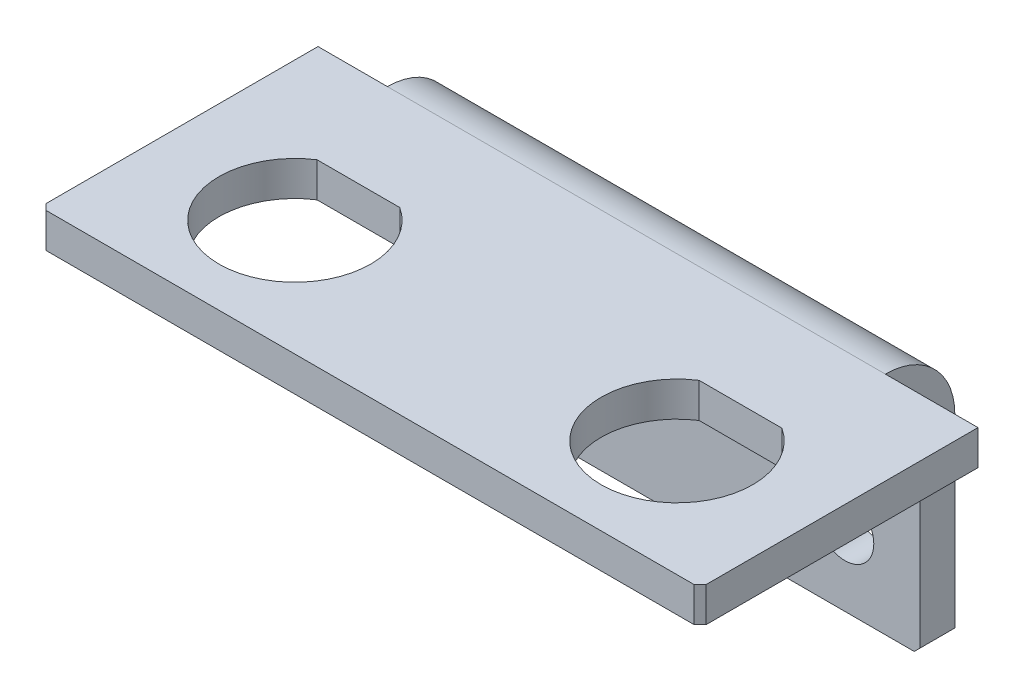
ISO-10303-21;
HEADER;
FILE_DESCRIPTION(('STEP AP214'),'2;1');
FILE_NAME('part.step','',(''),(''),'','','');
FILE_SCHEMA(('AUTOMOTIVE_DESIGN { 1 0 10303 214 1 1 1 1 }'));
ENDSEC;
DATA;
#1=APPLICATION_CONTEXT('core data for automotive mechanical design processes');
#2=APPLICATION_PROTOCOL_DEFINITION('international standard','automotive_design',2000,#1);
#3=PRODUCT_CONTEXT('',#1,'mechanical');
#4=PRODUCT('Part','Part','',(#3));
#5=PRODUCT_RELATED_PRODUCT_CATEGORY('part','',(#4));
#6=PRODUCT_DEFINITION_FORMATION('','',#4);
#7=PRODUCT_DEFINITION_CONTEXT('part definition',#1,'design');
#8=PRODUCT_DEFINITION('design','',#6,#7);
#9=PRODUCT_DEFINITION_SHAPE('','',#8);
#10=(LENGTH_UNIT() NAMED_UNIT(*) SI_UNIT(.MILLI.,.METRE.));
#11=(NAMED_UNIT(*) PLANE_ANGLE_UNIT() SI_UNIT($,.RADIAN.));
#12=(NAMED_UNIT(*) SI_UNIT($,.STERADIAN.) SOLID_ANGLE_UNIT());
#13=UNCERTAINTY_MEASURE_WITH_UNIT(LENGTH_MEASURE(1.E-05),#10,'distance_accuracy_value','');
#14=(GEOMETRIC_REPRESENTATION_CONTEXT(3) GLOBAL_UNCERTAINTY_ASSIGNED_CONTEXT((#13)) GLOBAL_UNIT_ASSIGNED_CONTEXT((#10,
#11,#12)) REPRESENTATION_CONTEXT('',''));
#15=CARTESIAN_POINT('',(0.,0.,0.));
#16=DIRECTION('',(0.,0.,1.));
#17=DIRECTION('',(1.,0.,0.));
#18=AXIS2_PLACEMENT_3D('',#15,#16,#17);
#19=CARTESIAN_POINT('',(0.,0.,-1.5));
#20=DIRECTION('',(0.,0.,1.));
#21=DIRECTION('',(1.,0.,0.));
#22=AXIS2_PLACEMENT_3D('',#19,#20,#21);
#23=PLANE('',#22);
#24=CARTESIAN_POINT('',(3.25,3.15,-1.5));
#25=DIRECTION('',(0.,0.,1.));
#26=DIRECTION('',(1.,0.,0.));
#27=AXIS2_PLACEMENT_3D('',#24,#25,#26);
#28=CIRCLE('',#27,1.25);
#29=CARTESIAN_POINT('',(4.5,3.15,-1.5));
#30=VERTEX_POINT('',#29);
#31=EDGE_CURVE('E204',#30,#30,#28,.T.);
#32=ORIENTED_EDGE('',*,*,#31,.T.);
#33=EDGE_LOOP('',(#32));
#34=FACE_BOUND('',#33,.T.);
#35=CARTESIAN_POINT('',(18.25,3.15,-1.5));
#36=DIRECTION('',(0.,0.,1.));
#37=DIRECTION('',(1.,0.,0.));
#38=AXIS2_PLACEMENT_3D('',#35,#36,#37);
#39=CIRCLE('',#38,1.25);
#40=CARTESIAN_POINT('',(19.5,3.15,-1.5));
#41=VERTEX_POINT('',#40);
#42=EDGE_CURVE('E20',#41,#41,#39,.T.);
#43=ORIENTED_EDGE('',*,*,#42,.T.);
#44=EDGE_LOOP('',(#43));
#45=FACE_BOUND('',#44,.T.);
#46=DIRECTION('',(0.,1.,0.));
#47=VECTOR('',#46,1.);
#48=CARTESIAN_POINT('',(0.,5.625,-1.5));
#49=LINE('',#48,#47);
#50=CARTESIAN_POINT('',(0.,8.25,-1.5));
#51=VERTEX_POINT('',#50);
#52=CARTESIAN_POINT('',(0.,0.254,-1.5));
#53=VERTEX_POINT('',#52);
#54=EDGE_CURVE('E228',#51,#53,#49,.F.);
#55=ORIENTED_EDGE('',*,*,#54,.F.);
#56=DIRECTION('',(-1.,0.,0.));
#57=VECTOR('',#56,1.);
#58=CARTESIAN_POINT('',(21.5,8.25,-1.5));
#59=LINE('',#58,#57);
#60=CARTESIAN_POINT('',(21.5,8.25,-1.5));
#61=VERTEX_POINT('',#60);
#62=EDGE_CURVE('E203',#61,#51,#59,.T.);
#63=ORIENTED_EDGE('',*,*,#62,.F.);
#64=DIRECTION('',(0.,1.,0.));
#65=VECTOR('',#64,1.);
#66=CARTESIAN_POINT('',(21.5,7.803097245096,-1.5));
#67=LINE('',#66,#65);
#68=CARTESIAN_POINT('',(21.5,0.254000000000003,-1.5));
#69=VERTEX_POINT('',#68);
#70=EDGE_CURVE('E160',#61,#69,#67,.F.);
#71=ORIENTED_EDGE('',*,*,#70,.T.);
#72=DIRECTION('',(0.707106781186498,0.707106781186598,0.));
#73=VECTOR('',#72,1.);
#74=CARTESIAN_POINT('',(21.373,0.127,-1.5));
#75=LINE('',#74,#73);
#76=CARTESIAN_POINT('',(21.246,0.,-1.5));
#77=VERTEX_POINT('',#76);
#78=EDGE_CURVE('E153',#77,#69,#75,.T.);
#79=ORIENTED_EDGE('',*,*,#78,.F.);
#80=DIRECTION('',(1.,0.,0.));
#81=VECTOR('',#80,1.);
#82=CARTESIAN_POINT('',(10.75,0.,-1.5));
#83=LINE('',#82,#81);
#84=CARTESIAN_POINT('',(0.254,0.,-1.5));
#85=VERTEX_POINT('',#84);
#86=EDGE_CURVE('E138',#85,#77,#83,.T.);
#87=ORIENTED_EDGE('',*,*,#86,.F.);
#88=DIRECTION('',(0.707106781186548,-0.707106781186548,0.));
#89=VECTOR('',#88,1.);
#90=CARTESIAN_POINT('',(0.127,0.127,-1.5));
#91=LINE('',#90,#89);
#92=EDGE_CURVE('E213',#53,#85,#91,.T.);
#93=ORIENTED_EDGE('',*,*,#92,.F.);
#94=EDGE_LOOP('',(#55,#63,#71,#79,#87,#93));
#95=FACE_BOUND('',#94,.T.);
#96=ADVANCED_FACE('F17',(#34,#45,#95),#23,.F.);
#97=CARTESIAN_POINT('',(10.75,0.,-0.75));
#98=DIRECTION('',(0.,-1.,0.));
#99=DIRECTION('',(0.,0.,-1.));
#100=AXIS2_PLACEMENT_3D('',#97,#98,#99);
#101=PLANE('',#100);
#102=DIRECTION('',(1.,0.,0.));
#103=VECTOR('',#102,1.);
#104=CARTESIAN_POINT('',(0.,0.,0.));
#105=LINE('',#104,#103);
#106=CARTESIAN_POINT('',(0.254,0.,0.));
#107=VERTEX_POINT('',#106);
#108=CARTESIAN_POINT('',(21.246,0.,0.));
#109=VERTEX_POINT('',#108);
#110=EDGE_CURVE('E202',#107,#109,#105,.T.);
#111=ORIENTED_EDGE('',*,*,#110,.F.);
#112=DIRECTION('',(0.,0.,1.));
#113=VECTOR('',#112,1.);
#114=CARTESIAN_POINT('',(0.254,0.,-0.75));
#115=LINE('',#114,#113);
#116=EDGE_CURVE('E144',#85,#107,#115,.T.);
#117=ORIENTED_EDGE('',*,*,#116,.F.);
#118=ORIENTED_EDGE('',*,*,#86,.T.);
#119=DIRECTION('',(0.,0.,1.));
#120=VECTOR('',#119,1.);
#121=CARTESIAN_POINT('',(21.246,0.,-0.75));
#122=LINE('',#121,#120);
#123=EDGE_CURVE('E142',#109,#77,#122,.F.);
#124=ORIENTED_EDGE('',*,*,#123,.F.);
#125=EDGE_LOOP('',(#111,#117,#118,#124));
#126=FACE_BOUND('',#125,.T.);
#127=ADVANCED_FACE('F141',(#126),#101,.T.);
#128=CARTESIAN_POINT('',(21.373,0.127,-0.75));
#129=DIRECTION('',(0.707106781186598,-0.707106781186498,0.));
#130=DIRECTION('',(0.707106781186498,0.707106781186598,0.));
#131=AXIS2_PLACEMENT_3D('',#128,#129,#130);
#132=PLANE('',#131);
#133=DIRECTION('',(0.,0.,-1.));
#134=VECTOR('',#133,1.);
#135=CARTESIAN_POINT('',(21.5,0.254,-0.75));
#136=LINE('',#135,#134);
#137=CARTESIAN_POINT('',(21.5,0.254,0.));
#138=VERTEX_POINT('',#137);
#139=EDGE_CURVE('E161',#138,#69,#136,.T.);
#140=ORIENTED_EDGE('',*,*,#139,.F.);
#141=DIRECTION('',(0.707106781186553,0.707106781186542,0.));
#142=VECTOR('',#141,1.);
#143=CARTESIAN_POINT('',(21.246,0.,0.));
#144=LINE('',#143,#142);
#145=EDGE_CURVE('E156',#109,#138,#144,.T.);
#146=ORIENTED_EDGE('',*,*,#145,.F.);
#147=ORIENTED_EDGE('',*,*,#123,.T.);
#148=ORIENTED_EDGE('',*,*,#78,.T.);
#149=EDGE_LOOP('',(#140,#146,#147,#148));
#150=FACE_BOUND('',#149,.T.);
#151=ADVANCED_FACE('F152',(#150),#132,.T.);
#152=CARTESIAN_POINT('',(0.127,0.127,-0.75));
#153=DIRECTION('',(-0.707106781186548,-0.707106781186548,0.));
#154=DIRECTION('',(0.707106781186548,-0.707106781186548,0.));
#155=AXIS2_PLACEMENT_3D('',#152,#153,#154);
#156=PLANE('',#155);
#157=ORIENTED_EDGE('',*,*,#116,.T.);
#158=DIRECTION('',(0.707106781186548,-0.707106781186548,0.));
#159=VECTOR('',#158,1.);
#160=CARTESIAN_POINT('',(0.,0.254,0.));
#161=LINE('',#160,#159);
#162=CARTESIAN_POINT('',(0.,0.254,0.));
#163=VERTEX_POINT('',#162);
#164=EDGE_CURVE('E201',#163,#107,#161,.T.);
#165=ORIENTED_EDGE('',*,*,#164,.F.);
#166=DIRECTION('',(0.,0.,1.));
#167=VECTOR('',#166,1.);
#168=CARTESIAN_POINT('',(0.,0.254,-0.75));
#169=LINE('',#168,#167);
#170=EDGE_CURVE('E219',#163,#53,#169,.F.);
#171=ORIENTED_EDGE('',*,*,#170,.T.);
#172=ORIENTED_EDGE('',*,*,#92,.T.);
#173=EDGE_LOOP('',(#157,#165,#171,#172));
#174=FACE_BOUND('',#173,.T.);
#175=ADVANCED_FACE('F243',(#174),#156,.T.);
#176=CARTESIAN_POINT('',(18.25,3.15,-3.15));
#177=DIRECTION('',(0.,0.,1.));
#178=DIRECTION('',(1.,0.,0.));
#179=AXIS2_PLACEMENT_3D('',#176,#177,#178);
#180=CYLINDRICAL_SURFACE('',#179,1.25);
#181=ORIENTED_EDGE('',*,*,#42,.F.);
#182=EDGE_LOOP('',(#181));
#183=FACE_BOUND('',#182,.T.);
#184=CARTESIAN_POINT('',(18.25,3.15,0.));
#185=DIRECTION('',(0.,0.,1.));
#186=DIRECTION('',(1.,0.,0.));
#187=AXIS2_PLACEMENT_3D('',#184,#185,#186);
#188=CIRCLE('',#187,1.25);
#189=CARTESIAN_POINT('',(19.5,3.15,0.));
#190=VERTEX_POINT('',#189);
#191=EDGE_CURVE('E198',#190,#190,#188,.F.);
#192=ORIENTED_EDGE('',*,*,#191,.F.);
#193=EDGE_LOOP('',(#192));
#194=FACE_BOUND('',#193,.T.);
#195=ADVANCED_FACE('F486',(#183,#194),#180,.F.);
#196=CARTESIAN_POINT('',(3.25,3.15,-3.154987396586));
#197=DIRECTION('',(0.,0.,1.));
#198=DIRECTION('',(1.,0.,0.));
#199=AXIS2_PLACEMENT_3D('',#196,#197,#198);
#200=CYLINDRICAL_SURFACE('',#199,1.25);
#201=ORIENTED_EDGE('',*,*,#31,.F.);
#202=EDGE_LOOP('',(#201));
#203=FACE_BOUND('',#202,.T.);
#204=CARTESIAN_POINT('',(3.25,3.15,0.));
#205=DIRECTION('',(0.,0.,1.));
#206=DIRECTION('',(1.,0.,0.));
#207=AXIS2_PLACEMENT_3D('',#204,#205,#206);
#208=CIRCLE('',#207,1.25);
#209=CARTESIAN_POINT('',(4.5,3.15,0.));
#210=VERTEX_POINT('',#209);
#211=EDGE_CURVE('E195',#210,#210,#208,.F.);
#212=ORIENTED_EDGE('',*,*,#211,.F.);
#213=EDGE_LOOP('',(#212));
#214=FACE_BOUND('',#213,.T.);
#215=ADVANCED_FACE('F483',(#203,#214),#200,.F.);
#216=CARTESIAN_POINT('',(21.5,8.25,1.5));
#217=DIRECTION('',(-1.,0.,0.));
#218=DIRECTION('',(0.,0.,1.));
#219=AXIS2_PLACEMENT_3D('',#216,#217,#218);
#220=CYLINDRICAL_SURFACE('',#219,3.);
#221=ORIENTED_EDGE('',*,*,#62,.T.);
#222=CARTESIAN_POINT('',(0.,8.25,1.5));
#223=DIRECTION('',(-1.,0.,0.));
#224=DIRECTION('',(0.,0.,1.));
#225=AXIS2_PLACEMENT_3D('',#222,#223,#224);
#226=CIRCLE('',#225,3.);
#227=CARTESIAN_POINT('',(0.,11.25,1.5));
#228=VERTEX_POINT('',#227);
#229=EDGE_CURVE('E191',#51,#228,#226,.F.);
#230=ORIENTED_EDGE('',*,*,#229,.T.);
#231=DIRECTION('',(1.,0.,0.));
#232=VECTOR('',#231,1.);
#233=CARTESIAN_POINT('',(0.,11.25,1.5));
#234=LINE('',#233,#232);
#235=CARTESIAN_POINT('',(21.5,11.25,1.5));
#236=VERTEX_POINT('',#235);
#237=EDGE_CURVE('E194',#236,#228,#234,.F.);
#238=ORIENTED_EDGE('',*,*,#237,.F.);
#239=CARTESIAN_POINT('',(21.5,8.25,1.5));
#240=DIRECTION('',(-1.,0.,0.));
#241=DIRECTION('',(0.,0.,1.));
#242=AXIS2_PLACEMENT_3D('',#239,#240,#241);
#243=CIRCLE('',#242,3.);
#244=EDGE_CURVE('E88',#236,#61,#243,.T.);
#245=ORIENTED_EDGE('',*,*,#244,.T.);
#246=EDGE_LOOP('',(#221,#230,#238,#245));
#247=FACE_BOUND('',#246,.T.);
#248=ADVANCED_FACE('F461',(#247),#220,.T.);
#249=CARTESIAN_POINT('',(21.5,8.303093886215,-0.75));
#250=DIRECTION('',(-1.,0.,0.));
#251=DIRECTION('',(0.,0.,1.));
#252=AXIS2_PLACEMENT_3D('',#249,#250,#251);
#253=PLANE('',#252);
#254=ORIENTED_EDGE('',*,*,#244,.F.);
#255=DIRECTION('',(0.,1.,0.));
#256=VECTOR('',#255,1.);
#257=CARTESIAN_POINT('',(21.5,10.5,1.5));
#258=LINE('',#257,#256);
#259=CARTESIAN_POINT('',(21.5,9.75,1.5));
#260=VERTEX_POINT('',#259);
#261=EDGE_CURVE('E190',#236,#260,#258,.F.);
#262=ORIENTED_EDGE('',*,*,#261,.T.);
#263=CARTESIAN_POINT('',(21.5,8.25,1.5));
#264=DIRECTION('',(-1.,0.,0.));
#265=DIRECTION('',(0.,0.,1.));
#266=AXIS2_PLACEMENT_3D('',#263,#264,#265);
#267=CIRCLE('',#266,1.5);
#268=CARTESIAN_POINT('',(21.5,8.25,0.));
#269=VERTEX_POINT('',#268);
#270=EDGE_CURVE('E183',#260,#269,#267,.T.);
#271=ORIENTED_EDGE('',*,*,#270,.T.);
#272=DIRECTION('',(0.,1.,0.));
#273=VECTOR('',#272,1.);
#274=CARTESIAN_POINT('',(21.5,0.,0.));
#275=LINE('',#274,#273);
#276=EDGE_CURVE('E246',#138,#269,#275,.T.);
#277=ORIENTED_EDGE('',*,*,#276,.F.);
#278=ORIENTED_EDGE('',*,*,#139,.T.);
#279=ORIENTED_EDGE('',*,*,#70,.F.);
#280=EDGE_LOOP('',(#254,#262,#271,#277,#278,#279));
#281=FACE_BOUND('',#280,.T.);
#282=ADVANCED_FACE('F459',(#281),#253,.F.);
#283=CARTESIAN_POINT('',(0.,0.,0.));
#284=DIRECTION('',(0.,0.,1.));
#285=DIRECTION('',(1.,0.,0.));
#286=AXIS2_PLACEMENT_3D('',#283,#284,#285);
#287=PLANE('',#286);
#288=ORIENTED_EDGE('',*,*,#211,.T.);
#289=EDGE_LOOP('',(#288));
#290=FACE_BOUND('',#289,.T.);
#291=ORIENTED_EDGE('',*,*,#191,.T.);
#292=EDGE_LOOP('',(#291));
#293=FACE_BOUND('',#292,.T.);
#294=DIRECTION('',(0.,1.,0.));
#295=VECTOR('',#294,1.);
#296=CARTESIAN_POINT('',(0.,0.,0.));
#297=LINE('',#296,#295);
#298=CARTESIAN_POINT('',(0.,8.25,0.));
#299=VERTEX_POINT('',#298);
#300=EDGE_CURVE('E245',#299,#163,#297,.F.);
#301=ORIENTED_EDGE('',*,*,#300,.T.);
#302=ORIENTED_EDGE('',*,*,#164,.T.);
#303=ORIENTED_EDGE('',*,*,#110,.T.);
#304=ORIENTED_EDGE('',*,*,#145,.T.);
#305=ORIENTED_EDGE('',*,*,#276,.T.);
#306=DIRECTION('',(-1.,0.,0.));
#307=VECTOR('',#306,1.);
#308=CARTESIAN_POINT('',(21.5,8.25,0.));
#309=LINE('',#308,#307);
#310=EDGE_CURVE('E186',#269,#299,#309,.T.);
#311=ORIENTED_EDGE('',*,*,#310,.T.);
#312=EDGE_LOOP('',(#301,#302,#303,#304,#305,#311));
#313=FACE_BOUND('',#312,.T.);
#314=ADVANCED_FACE('F475',(#290,#293,#313),#287,.T.);
#315=CARTESIAN_POINT('',(0.,9.856191131311,-0.75));
#316=DIRECTION('',(1.,0.,0.));
#317=DIRECTION('',(0.,0.,-1.));
#318=AXIS2_PLACEMENT_3D('',#315,#316,#317);
#319=PLANE('',#318);
#320=ORIENTED_EDGE('',*,*,#229,.F.);
#321=ORIENTED_EDGE('',*,*,#54,.T.);
#322=ORIENTED_EDGE('',*,*,#170,.F.);
#323=ORIENTED_EDGE('',*,*,#300,.F.);
#324=CARTESIAN_POINT('',(0.,8.25,1.5));
#325=DIRECTION('',(-1.,0.,0.));
#326=DIRECTION('',(0.,0.,1.));
#327=AXIS2_PLACEMENT_3D('',#324,#325,#326);
#328=CIRCLE('',#327,1.5);
#329=CARTESIAN_POINT('',(0.,9.75,1.5));
#330=VERTEX_POINT('',#329);
#331=EDGE_CURVE('E187',#299,#330,#328,.F.);
#332=ORIENTED_EDGE('',*,*,#331,.T.);
#333=DIRECTION('',(0.,1.,0.));
#334=VECTOR('',#333,1.);
#335=CARTESIAN_POINT('',(0.,10.5,1.5));
#336=LINE('',#335,#334);
#337=EDGE_CURVE('E343',#228,#330,#336,.F.);
#338=ORIENTED_EDGE('',*,*,#337,.F.);
#339=EDGE_LOOP('',(#320,#321,#322,#323,#332,#338));
#340=FACE_BOUND('',#339,.T.);
#341=ADVANCED_FACE('F241',(#340),#319,.F.);
#342=CARTESIAN_POINT('',(0.,11.25,-1.5));
#343=DIRECTION('',(0.,1.,0.));
#344=DIRECTION('',(0.,0.,1.));
#345=AXIS2_PLACEMENT_3D('',#342,#343,#344);
#346=PLANE('',#345);
#347=DIRECTION('',(-1.,0.,0.));
#348=VECTOR('',#347,1.);
#349=CARTESIAN_POINT('',(3.,11.25,5.755));
#350=LINE('',#349,#348);
#351=CARTESIAN_POINT('',(1.21377493019498,11.25,5.755));
#352=VERTEX_POINT('',#351);
#353=CARTESIAN_POINT('',(4.78622506980502,11.25,5.755));
#354=VERTEX_POINT('',#353);
#355=EDGE_CURVE('E358',#352,#354,#350,.F.);
#356=ORIENTED_EDGE('',*,*,#355,.T.);
#357=CARTESIAN_POINT('',(3.,11.25,8.5));
#358=DIRECTION('',(0.,1.,0.));
#359=DIRECTION('',(0.,0.,1.));
#360=AXIS2_PLACEMENT_3D('',#357,#358,#359);
#361=CIRCLE('',#360,3.275);
#362=EDGE_CURVE('E175',#354,#352,#361,.F.);
#363=ORIENTED_EDGE('',*,*,#362,.T.);
#364=EDGE_LOOP('',(#356,#363));
#365=FACE_BOUND('',#364,.T.);
#366=DIRECTION('',(-1.,0.,0.));
#367=VECTOR('',#366,1.);
#368=CARTESIAN_POINT('',(19.5,11.25,5.755));
#369=LINE('',#368,#367);
#370=CARTESIAN_POINT('',(17.7137749301925,11.25,5.755));
#371=VERTEX_POINT('',#370);
#372=CARTESIAN_POINT('',(21.2862250698075,11.25,5.755));
#373=VERTEX_POINT('',#372);
#374=EDGE_CURVE('E355',#371,#373,#369,.F.);
#375=ORIENTED_EDGE('',*,*,#374,.T.);
#376=CARTESIAN_POINT('',(19.5,11.25,8.5));
#377=DIRECTION('',(0.,1.,0.));
#378=DIRECTION('',(0.,0.,1.));
#379=AXIS2_PLACEMENT_3D('',#376,#377,#378);
#380=CIRCLE('',#379,3.275);
#381=EDGE_CURVE('E179',#373,#371,#380,.F.);
#382=ORIENTED_EDGE('',*,*,#381,.T.);
#383=EDGE_LOOP('',(#375,#382));
#384=FACE_BOUND('',#383,.T.);
#385=DIRECTION('',(0.,0.,1.));
#386=VECTOR('',#385,1.);
#387=CARTESIAN_POINT('',(-3.,11.25,6.));
#388=LINE('',#387,#386);
#389=CARTESIAN_POINT('',(-3.,11.25,13.246));
#390=VERTEX_POINT('',#389);
#391=CARTESIAN_POINT('',(-3.,11.25,1.5));
#392=VERTEX_POINT('',#391);
#393=EDGE_CURVE('E338',#390,#392,#388,.F.);
#394=ORIENTED_EDGE('',*,*,#393,.F.);
#395=DIRECTION('',(0.707106781186598,0.,0.707106781186498));
#396=VECTOR('',#395,1.);
#397=CARTESIAN_POINT('',(-2.873,11.25,13.373));
#398=LINE('',#397,#396);
#399=CARTESIAN_POINT('',(-2.746,11.25,13.5));
#400=VERTEX_POINT('',#399);
#401=EDGE_CURVE('E275',#400,#390,#398,.F.);
#402=ORIENTED_EDGE('',*,*,#401,.F.);
#403=DIRECTION('',(1.,0.,0.));
#404=VECTOR('',#403,1.);
#405=CARTESIAN_POINT('',(11.25,11.25,13.5));
#406=LINE('',#405,#404);
#407=CARTESIAN_POINT('',(25.246,11.25,13.5));
#408=VERTEX_POINT('',#407);
#409=EDGE_CURVE('E272',#408,#400,#406,.F.);
#410=ORIENTED_EDGE('',*,*,#409,.F.);
#411=DIRECTION('',(0.707106781186498,0.,-0.707106781186598));
#412=VECTOR('',#411,1.);
#413=CARTESIAN_POINT('',(25.373,11.25,13.373));
#414=LINE('',#413,#412);
#415=CARTESIAN_POINT('',(25.5,11.25,13.246));
#416=VERTEX_POINT('',#415);
#417=EDGE_CURVE('E295',#416,#408,#414,.F.);
#418=ORIENTED_EDGE('',*,*,#417,.F.);
#419=DIRECTION('',(0.,0.,-1.));
#420=VECTOR('',#419,1.);
#421=CARTESIAN_POINT('',(25.5,11.25,6.));
#422=LINE('',#421,#420);
#423=CARTESIAN_POINT('',(25.5,11.25,1.5));
#424=VERTEX_POINT('',#423);
#425=EDGE_CURVE('E97',#424,#416,#422,.F.);
#426=ORIENTED_EDGE('',*,*,#425,.F.);
#427=DIRECTION('',(1.,0.,0.));
#428=VECTOR('',#427,1.);
#429=CARTESIAN_POINT('',(23.5,11.25,1.5));
#430=LINE('',#429,#428);
#431=EDGE_CURVE('E318',#424,#236,#430,.F.);
#432=ORIENTED_EDGE('',*,*,#431,.T.);
#433=ORIENTED_EDGE('',*,*,#237,.T.);
#434=DIRECTION('',(-1.,0.,0.));
#435=VECTOR('',#434,1.);
#436=CARTESIAN_POINT('',(-1.5,11.25,1.5));
#437=LINE('',#436,#435);
#438=EDGE_CURVE('E333',#392,#228,#437,.F.);
#439=ORIENTED_EDGE('',*,*,#438,.F.);
#440=EDGE_LOOP('',(#394,#402,#410,#418,#426,#432,#433,#439));
#441=FACE_BOUND('',#440,.T.);
#442=ADVANCED_FACE('F385',(#365,#384,#441),#346,.T.);
#443=CARTESIAN_POINT('',(-2.873,10.5,13.373));
#444=DIRECTION('',(-0.707106781186498,0.,0.707106781186598));
#445=DIRECTION('',(0.707106781186598,0.,0.707106781186498));
#446=AXIS2_PLACEMENT_3D('',#443,#444,#445);
#447=PLANE('',#446);
#448=DIRECTION('',(0.,1.,0.));
#449=VECTOR('',#448,1.);
#450=CARTESIAN_POINT('',(-2.746,10.5,13.5));
#451=LINE('',#450,#449);
#452=CARTESIAN_POINT('',(-2.746,9.75,13.5));
#453=VERTEX_POINT('',#452);
#454=EDGE_CURVE('E268',#400,#453,#451,.F.);
#455=ORIENTED_EDGE('',*,*,#454,.F.);
#456=ORIENTED_EDGE('',*,*,#401,.T.);
#457=DIRECTION('',(0.,1.,0.));
#458=VECTOR('',#457,1.);
#459=CARTESIAN_POINT('',(-3.,10.5,13.246));
#460=LINE('',#459,#458);
#461=CARTESIAN_POINT('',(-3.,9.75,13.246));
#462=VERTEX_POINT('',#461);
#463=EDGE_CURVE('E182',#462,#390,#460,.T.);
#464=ORIENTED_EDGE('',*,*,#463,.F.);
#465=DIRECTION('',(0.707106781186549,0.,0.707106781186546));
#466=VECTOR('',#465,1.);
#467=CARTESIAN_POINT('',(-3.,9.75,13.246));
#468=LINE('',#467,#466);
#469=EDGE_CURVE('E283',#462,#453,#468,.T.);
#470=ORIENTED_EDGE('',*,*,#469,.T.);
#471=EDGE_LOOP('',(#455,#456,#464,#470));
#472=FACE_BOUND('',#471,.T.);
#473=ADVANCED_FACE('F387',(#472),#447,.T.);
#474=CARTESIAN_POINT('',(11.25,10.5,13.5));
#475=DIRECTION('',(0.,0.,1.));
#476=DIRECTION('',(1.,0.,0.));
#477=AXIS2_PLACEMENT_3D('',#474,#475,#476);
#478=PLANE('',#477);
#479=ORIENTED_EDGE('',*,*,#409,.T.);
#480=ORIENTED_EDGE('',*,*,#454,.T.);
#481=DIRECTION('',(1.,0.,0.));
#482=VECTOR('',#481,1.);
#483=CARTESIAN_POINT('',(0.,9.75,13.5));
#484=LINE('',#483,#482);
#485=CARTESIAN_POINT('',(25.246,9.75,13.5));
#486=VERTEX_POINT('',#485);
#487=EDGE_CURVE('E279',#453,#486,#484,.T.);
#488=ORIENTED_EDGE('',*,*,#487,.T.);
#489=DIRECTION('',(0.,1.,0.));
#490=VECTOR('',#489,1.);
#491=CARTESIAN_POINT('',(25.246,10.5,13.5));
#492=LINE('',#491,#490);
#493=EDGE_CURVE('E271',#408,#486,#492,.F.);
#494=ORIENTED_EDGE('',*,*,#493,.F.);
#495=EDGE_LOOP('',(#479,#480,#488,#494));
#496=FACE_BOUND('',#495,.T.);
#497=ADVANCED_FACE('F426',(#496),#478,.T.);
#498=CARTESIAN_POINT('',(25.373,10.5,13.373));
#499=DIRECTION('',(0.707106781186598,0.,0.707106781186498));
#500=DIRECTION('',(0.707106781186498,0.,-0.707106781186598));
#501=AXIS2_PLACEMENT_3D('',#498,#499,#500);
#502=PLANE('',#501);
#503=DIRECTION('',(0.,1.,0.));
#504=VECTOR('',#503,1.);
#505=CARTESIAN_POINT('',(25.5,10.5,13.246));
#506=LINE('',#505,#504);
#507=CARTESIAN_POINT('',(25.5,9.75,13.246));
#508=VERTEX_POINT('',#507);
#509=EDGE_CURVE('E298',#416,#508,#506,.F.);
#510=ORIENTED_EDGE('',*,*,#509,.F.);
#511=ORIENTED_EDGE('',*,*,#417,.T.);
#512=ORIENTED_EDGE('',*,*,#493,.T.);
#513=DIRECTION('',(0.707106781186555,0.,-0.70710678118654));
#514=VECTOR('',#513,1.);
#515=CARTESIAN_POINT('',(25.246,9.75,13.5));
#516=LINE('',#515,#514);
#517=EDGE_CURVE('E282',#486,#508,#516,.T.);
#518=ORIENTED_EDGE('',*,*,#517,.T.);
#519=EDGE_LOOP('',(#510,#511,#512,#518));
#520=FACE_BOUND('',#519,.T.);
#521=ADVANCED_FACE('F417',(#520),#502,.T.);
#522=CARTESIAN_POINT('',(25.5,10.5,6.));
#523=DIRECTION('',(1.,0.,0.));
#524=DIRECTION('',(0.,0.,-1.));
#525=AXIS2_PLACEMENT_3D('',#522,#523,#524);
#526=PLANE('',#525);
#527=ORIENTED_EDGE('',*,*,#425,.T.);
#528=ORIENTED_EDGE('',*,*,#509,.T.);
#529=DIRECTION('',(0.,0.,1.));
#530=VECTOR('',#529,1.);
#531=CARTESIAN_POINT('',(25.5,9.75,-1.5));
#532=LINE('',#531,#530);
#533=CARTESIAN_POINT('',(25.5,9.75,1.5));
#534=VERTEX_POINT('',#533);
#535=EDGE_CURVE('E288',#508,#534,#532,.F.);
#536=ORIENTED_EDGE('',*,*,#535,.T.);
#537=DIRECTION('',(0.,1.,0.));
#538=VECTOR('',#537,1.);
#539=CARTESIAN_POINT('',(25.5,10.5,1.5));
#540=LINE('',#539,#538);
#541=EDGE_CURVE('E301',#534,#424,#540,.T.);
#542=ORIENTED_EDGE('',*,*,#541,.T.);
#543=EDGE_LOOP('',(#527,#528,#536,#542));
#544=FACE_BOUND('',#543,.T.);
#545=ADVANCED_FACE('F415',(#544),#526,.T.);
#546=CARTESIAN_POINT('',(23.5,10.5,1.5));
#547=DIRECTION('',(0.,0.,1.));
#548=DIRECTION('',(1.,0.,0.));
#549=AXIS2_PLACEMENT_3D('',#546,#547,#548);
#550=PLANE('',#549);
#551=ORIENTED_EDGE('',*,*,#431,.F.);
#552=ORIENTED_EDGE('',*,*,#541,.F.);
#553=DIRECTION('',(1.,0.,0.));
#554=VECTOR('',#553,1.);
#555=CARTESIAN_POINT('',(0.,9.75,1.5));
#556=LINE('',#555,#554);
#557=EDGE_CURVE('E310',#534,#260,#556,.F.);
#558=ORIENTED_EDGE('',*,*,#557,.T.);
#559=ORIENTED_EDGE('',*,*,#261,.F.);
#560=EDGE_LOOP('',(#551,#552,#558,#559));
#561=FACE_BOUND('',#560,.T.);
#562=ADVANCED_FACE('F410',(#561),#550,.F.);
#563=CARTESIAN_POINT('',(21.5,8.25,1.5));
#564=DIRECTION('',(-1.,0.,0.));
#565=DIRECTION('',(0.,0.,1.));
#566=AXIS2_PLACEMENT_3D('',#563,#564,#565);
#567=CYLINDRICAL_SURFACE('',#566,1.5);
#568=ORIENTED_EDGE('',*,*,#270,.F.);
#569=DIRECTION('',(1.,0.,0.));
#570=VECTOR('',#569,1.);
#571=CARTESIAN_POINT('',(0.,9.75,1.5));
#572=LINE('',#571,#570);
#573=EDGE_CURVE('E326',#260,#330,#572,.F.);
#574=ORIENTED_EDGE('',*,*,#573,.T.);
#575=ORIENTED_EDGE('',*,*,#331,.F.);
#576=ORIENTED_EDGE('',*,*,#310,.F.);
#577=EDGE_LOOP('',(#568,#574,#575,#576));
#578=FACE_BOUND('',#577,.T.);
#579=ADVANCED_FACE('F424',(#578),#567,.F.);
#580=CARTESIAN_POINT('',(-1.5,10.5,1.5));
#581=DIRECTION('',(0.,0.,-1.));
#582=DIRECTION('',(-1.,0.,0.));
#583=AXIS2_PLACEMENT_3D('',#580,#581,#582);
#584=PLANE('',#583);
#585=ORIENTED_EDGE('',*,*,#337,.T.);
#586=DIRECTION('',(1.,0.,0.));
#587=VECTOR('',#586,1.);
#588=CARTESIAN_POINT('',(0.,9.75,1.5));
#589=LINE('',#588,#587);
#590=CARTESIAN_POINT('',(-3.,9.75,1.5));
#591=VERTEX_POINT('',#590);
#592=EDGE_CURVE('E347',#330,#591,#589,.F.);
#593=ORIENTED_EDGE('',*,*,#592,.T.);
#594=DIRECTION('',(0.,1.,0.));
#595=VECTOR('',#594,1.);
#596=CARTESIAN_POINT('',(-3.,10.5,1.5));
#597=LINE('',#596,#595);
#598=EDGE_CURVE('E265',#392,#591,#597,.F.);
#599=ORIENTED_EDGE('',*,*,#598,.F.);
#600=ORIENTED_EDGE('',*,*,#438,.T.);
#601=EDGE_LOOP('',(#585,#593,#599,#600));
#602=FACE_BOUND('',#601,.T.);
#603=ADVANCED_FACE('F449',(#602),#584,.T.);
#604=CARTESIAN_POINT('',(-3.,10.5,6.));
#605=DIRECTION('',(-1.,0.,0.));
#606=DIRECTION('',(0.,0.,1.));
#607=AXIS2_PLACEMENT_3D('',#604,#605,#606);
#608=PLANE('',#607);
#609=DIRECTION('',(0.,0.,1.));
#610=VECTOR('',#609,1.);
#611=CARTESIAN_POINT('',(-3.,9.75,-1.5));
#612=LINE('',#611,#610);
#613=EDGE_CURVE('E174',#591,#462,#612,.T.);
#614=ORIENTED_EDGE('',*,*,#613,.T.);
#615=ORIENTED_EDGE('',*,*,#463,.T.);
#616=ORIENTED_EDGE('',*,*,#393,.T.);
#617=ORIENTED_EDGE('',*,*,#598,.T.);
#618=EDGE_LOOP('',(#614,#615,#616,#617));
#619=FACE_BOUND('',#618,.T.);
#620=ADVANCED_FACE('F396',(#619),#608,.T.);
#621=CARTESIAN_POINT('',(19.5,10.5,8.5));
#622=DIRECTION('',(0.,1.,0.));
#623=DIRECTION('',(0.,0.,1.));
#624=AXIS2_PLACEMENT_3D('',#621,#622,#623);
#625=CYLINDRICAL_SURFACE('',#624,3.275);
#626=ORIENTED_EDGE('',*,*,#381,.F.);
#627=DIRECTION('',(0.,1.,0.));
#628=VECTOR('',#627,1.);
#629=CARTESIAN_POINT('',(21.28622506981,10.5,5.755));
#630=LINE('',#629,#628);
#631=CARTESIAN_POINT('',(21.2862250698075,9.75,5.755));
#632=VERTEX_POINT('',#631);
#633=EDGE_CURVE('E178',#373,#632,#630,.F.);
#634=ORIENTED_EDGE('',*,*,#633,.T.);
#635=CARTESIAN_POINT('',(19.5,9.75,8.5));
#636=DIRECTION('',(0.,1.,0.));
#637=DIRECTION('',(0.,0.,1.));
#638=AXIS2_PLACEMENT_3D('',#635,#636,#637);
#639=CIRCLE('',#638,3.275);
#640=CARTESIAN_POINT('',(17.7137749301925,9.75,5.755));
#641=VERTEX_POINT('',#640);
#642=EDGE_CURVE('E172',#632,#641,#639,.F.);
#643=ORIENTED_EDGE('',*,*,#642,.T.);
#644=DIRECTION('',(0.,1.,0.));
#645=VECTOR('',#644,1.);
#646=CARTESIAN_POINT('',(17.71377493019,10.5,5.755));
#647=LINE('',#646,#645);
#648=EDGE_CURVE('E181',#641,#371,#647,.T.);
#649=ORIENTED_EDGE('',*,*,#648,.T.);
#650=EDGE_LOOP('',(#626,#634,#643,#649));
#651=FACE_BOUND('',#650,.T.);
#652=ADVANCED_FACE('F383',(#651),#625,.F.);
#653=CARTESIAN_POINT('',(19.5,10.5,5.755));
#654=DIRECTION('',(0.,0.,-1.));
#655=DIRECTION('',(-1.,0.,0.));
#656=AXIS2_PLACEMENT_3D('',#653,#654,#655);
#657=PLANE('',#656);
#658=ORIENTED_EDGE('',*,*,#374,.F.);
#659=ORIENTED_EDGE('',*,*,#648,.F.);
#660=DIRECTION('',(1.,0.,0.));
#661=VECTOR('',#660,1.);
#662=CARTESIAN_POINT('',(0.,9.75,5.755));
#663=LINE('',#662,#661);
#664=EDGE_CURVE('E171',#641,#632,#663,.T.);
#665=ORIENTED_EDGE('',*,*,#664,.T.);
#666=ORIENTED_EDGE('',*,*,#633,.F.);
#667=EDGE_LOOP('',(#658,#659,#665,#666));
#668=FACE_BOUND('',#667,.T.);
#669=ADVANCED_FACE('F378',(#668),#657,.F.);
#670=CARTESIAN_POINT('',(3.,10.5,8.5));
#671=DIRECTION('',(0.,1.,0.));
#672=DIRECTION('',(0.,0.,1.));
#673=AXIS2_PLACEMENT_3D('',#670,#671,#672);
#674=CYLINDRICAL_SURFACE('',#673,3.275);
#675=ORIENTED_EDGE('',*,*,#362,.F.);
#676=DIRECTION('',(0.,1.,0.));
#677=VECTOR('',#676,1.);
#678=CARTESIAN_POINT('',(4.786225069805,10.5,5.755));
#679=LINE('',#678,#677);
#680=CARTESIAN_POINT('',(4.78622506980502,9.75,5.755));
#681=VERTEX_POINT('',#680);
#682=EDGE_CURVE('E361',#354,#681,#679,.F.);
#683=ORIENTED_EDGE('',*,*,#682,.T.);
#684=CARTESIAN_POINT('',(3.,9.75,8.5));
#685=DIRECTION('',(0.,1.,0.));
#686=DIRECTION('',(0.,0.,1.));
#687=AXIS2_PLACEMENT_3D('',#684,#685,#686);
#688=CIRCLE('',#687,3.275);
#689=CARTESIAN_POINT('',(1.21377493019498,9.75,5.755));
#690=VERTEX_POINT('',#689);
#691=EDGE_CURVE('E26',#681,#690,#688,.F.);
#692=ORIENTED_EDGE('',*,*,#691,.T.);
#693=DIRECTION('',(0.,1.,0.));
#694=VECTOR('',#693,1.);
#695=CARTESIAN_POINT('',(1.213774930195,10.5,5.755));
#696=LINE('',#695,#694);
#697=EDGE_CURVE('E177',#690,#352,#696,.T.);
#698=ORIENTED_EDGE('',*,*,#697,.T.);
#699=EDGE_LOOP('',(#675,#683,#692,#698));
#700=FACE_BOUND('',#699,.T.);
#701=ADVANCED_FACE('F436',(#700),#674,.F.);
#702=CARTESIAN_POINT('',(3.,10.5,5.755));
#703=DIRECTION('',(0.,0.,-1.));
#704=DIRECTION('',(-1.,0.,0.));
#705=AXIS2_PLACEMENT_3D('',#702,#703,#704);
#706=PLANE('',#705);
#707=ORIENTED_EDGE('',*,*,#355,.F.);
#708=ORIENTED_EDGE('',*,*,#697,.F.);
#709=DIRECTION('',(1.,0.,0.));
#710=VECTOR('',#709,1.);
#711=CARTESIAN_POINT('',(0.,9.75,5.755));
#712=LINE('',#711,#710);
#713=EDGE_CURVE('E11',#690,#681,#712,.T.);
#714=ORIENTED_EDGE('',*,*,#713,.T.);
#715=ORIENTED_EDGE('',*,*,#682,.F.);
#716=EDGE_LOOP('',(#707,#708,#714,#715));
#717=FACE_BOUND('',#716,.T.);
#718=ADVANCED_FACE('F430',(#717),#706,.F.);
#719=CARTESIAN_POINT('',(0.,9.75,-1.5));
#720=DIRECTION('',(0.,1.,0.));
#721=DIRECTION('',(0.,0.,1.));
#722=AXIS2_PLACEMENT_3D('',#719,#720,#721);
#723=PLANE('',#722);
#724=ORIENTED_EDGE('',*,*,#713,.F.);
#725=ORIENTED_EDGE('',*,*,#691,.F.);
#726=EDGE_LOOP('',(#724,#725));
#727=FACE_BOUND('',#726,.T.);
#728=ORIENTED_EDGE('',*,*,#664,.F.);
#729=ORIENTED_EDGE('',*,*,#642,.F.);
#730=EDGE_LOOP('',(#728,#729));
#731=FACE_BOUND('',#730,.T.);
#732=ORIENTED_EDGE('',*,*,#592,.F.);
#733=ORIENTED_EDGE('',*,*,#573,.F.);
#734=ORIENTED_EDGE('',*,*,#557,.F.);
#735=ORIENTED_EDGE('',*,*,#535,.F.);
#736=ORIENTED_EDGE('',*,*,#517,.F.);
#737=ORIENTED_EDGE('',*,*,#487,.F.);
#738=ORIENTED_EDGE('',*,*,#469,.F.);
#739=ORIENTED_EDGE('',*,*,#613,.F.);
#740=EDGE_LOOP('',(#732,#733,#734,#735,#736,#737,#738,#739));
#741=FACE_BOUND('',#740,.T.);
#742=ADVANCED_FACE('F380',(#727,#731,#741),#723,.F.);
#743=CLOSED_SHELL('',(#96,#127,#151,#175,#195,#215,#248,#282,#314,#341,#442,#473,#497,#521,#545,
#562,#579,#603,#620,#652,#669,#701,#718,#742));
#744=MANIFOLD_SOLID_BREP('B1',#743);
#745=ADVANCED_BREP_SHAPE_REPRESENTATION('',(#18,#744),#14);
#746=SHAPE_DEFINITION_REPRESENTATION(#9,#745);
ENDSEC;
END-ISO-10303-21;
